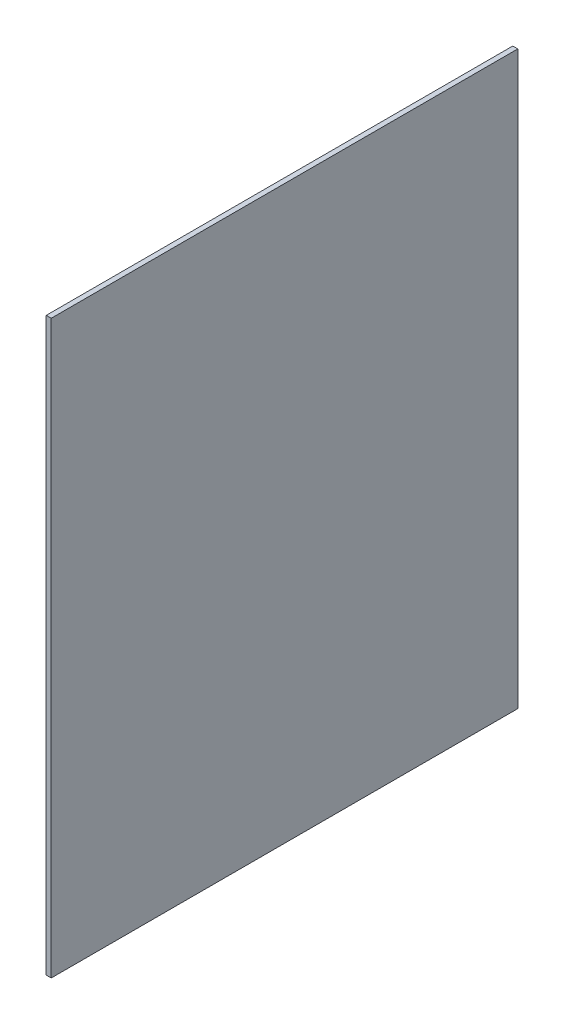
ISO-10303-21;
HEADER;
FILE_DESCRIPTION(('STEP AP214'),'2;1');
FILE_NAME('part.step','',(''),(''),'','','');
FILE_SCHEMA(('AUTOMOTIVE_DESIGN { 1 0 10303 214 1 1 1 1 }'));
ENDSEC;
DATA;
#1=APPLICATION_CONTEXT('core data for automotive mechanical design processes');
#2=APPLICATION_PROTOCOL_DEFINITION('international standard','automotive_design',2000,#1);
#3=PRODUCT_CONTEXT('',#1,'mechanical');
#4=PRODUCT('Part','Part','',(#3));
#5=PRODUCT_RELATED_PRODUCT_CATEGORY('part','',(#4));
#6=PRODUCT_DEFINITION_FORMATION('','',#4);
#7=PRODUCT_DEFINITION_CONTEXT('part definition',#1,'design');
#8=PRODUCT_DEFINITION('design','',#6,#7);
#9=PRODUCT_DEFINITION_SHAPE('','',#8);
#10=(LENGTH_UNIT() NAMED_UNIT(*) SI_UNIT(.MILLI.,.METRE.));
#11=(NAMED_UNIT(*) PLANE_ANGLE_UNIT() SI_UNIT($,.RADIAN.));
#12=(NAMED_UNIT(*) SI_UNIT($,.STERADIAN.) SOLID_ANGLE_UNIT());
#13=UNCERTAINTY_MEASURE_WITH_UNIT(LENGTH_MEASURE(1.E-05),#10,'distance_accuracy_value','');
#14=(GEOMETRIC_REPRESENTATION_CONTEXT(3) GLOBAL_UNCERTAINTY_ASSIGNED_CONTEXT((#13)) GLOBAL_UNIT_ASSIGNED_CONTEXT((#10,
#11,#12)) REPRESENTATION_CONTEXT('',''));
#15=CARTESIAN_POINT('',(0.,0.,0.));
#16=DIRECTION('',(0.,0.,1.));
#17=DIRECTION('',(1.,0.,0.));
#18=AXIS2_PLACEMENT_3D('',#15,#16,#17);
#19=CARTESIAN_POINT('',(9.525,-49.6523500577239,36.9162453960773));
#20=DIRECTION('',(0.,1.,0.));
#21=DIRECTION('',(0.,0.,1.));
#22=AXIS2_PLACEMENT_3D('',#19,#20,#21);
#23=PLANE('',#22);
#24=DIRECTION('',(0.,0.,-1.));
#25=VECTOR('',#24,1.);
#26=CARTESIAN_POINT('',(0.,-49.6523500577239,36.9162453960773));
#27=LINE('',#26,#25);
#28=CARTESIAN_POINT('',(0.,-49.6523500577239,36.9162453960773));
#29=VERTEX_POINT('',#28);
#30=CARTESIAN_POINT('',(0.,-49.6523500577239,-849.693166368629));
#31=VERTEX_POINT('',#30);
#32=EDGE_CURVE('E106',#29,#31,#27,.T.);
#33=ORIENTED_EDGE('',*,*,#32,.T.);
#34=DIRECTION('',(-1.,0.,0.));
#35=VECTOR('',#34,1.);
#36=CARTESIAN_POINT('',(9.525,-49.6523500577239,-849.693166368629));
#37=LINE('',#36,#35);
#38=CARTESIAN_POINT('',(9.525,-49.6523500577239,-849.693166368629));
#39=VERTEX_POINT('',#38);
#40=EDGE_CURVE('E11',#39,#31,#37,.T.);
#41=ORIENTED_EDGE('',*,*,#40,.F.);
#42=DIRECTION('',(0.,0.,-1.));
#43=VECTOR('',#42,1.);
#44=CARTESIAN_POINT('',(9.525,-49.6523500577239,36.9162453960773));
#45=LINE('',#44,#43);
#46=CARTESIAN_POINT('',(9.525,-49.6523500577239,36.9162453960773));
#47=VERTEX_POINT('',#46);
#48=EDGE_CURVE('E79',#47,#39,#45,.T.);
#49=ORIENTED_EDGE('',*,*,#48,.F.);
#50=DIRECTION('',(-1.,0.,0.));
#51=VECTOR('',#50,1.);
#52=CARTESIAN_POINT('',(9.525,-49.6523500577239,36.9162453960773));
#53=LINE('',#52,#51);
#54=EDGE_CURVE('E102',#47,#29,#53,.T.);
#55=ORIENTED_EDGE('',*,*,#54,.T.);
#56=EDGE_LOOP('',(#33,#41,#49,#55));
#57=FACE_BOUND('',#56,.T.);
#58=ADVANCED_FACE('F39',(#57),#23,.F.);
#59=CARTESIAN_POINT('',(9.525,1036.19764994228,-849.693166368629));
#60=DIRECTION('',(0.,0.,-1.));
#61=DIRECTION('',(0.,1.,0.));
#62=AXIS2_PLACEMENT_3D('',#59,#60,#61);
#63=PLANE('',#62);
#64=DIRECTION('',(0.,-1.,0.));
#65=VECTOR('',#64,1.);
#66=CARTESIAN_POINT('',(0.,1036.19764994228,-849.693166368629));
#67=LINE('',#66,#65);
#68=CARTESIAN_POINT('',(0.,1036.19764994228,-849.693166368629));
#69=VERTEX_POINT('',#68);
#70=EDGE_CURVE('E88',#69,#31,#67,.T.);
#71=ORIENTED_EDGE('',*,*,#70,.F.);
#72=DIRECTION('',(-1.,0.,0.));
#73=VECTOR('',#72,1.);
#74=CARTESIAN_POINT('',(9.525,1036.19764994228,-849.693166368629));
#75=LINE('',#74,#73);
#76=CARTESIAN_POINT('',(9.525,1036.19764994228,-849.693166368629));
#77=VERTEX_POINT('',#76);
#78=EDGE_CURVE('E48',#77,#69,#75,.T.);
#79=ORIENTED_EDGE('',*,*,#78,.F.);
#80=DIRECTION('',(0.,-1.,0.));
#81=VECTOR('',#80,1.);
#82=CARTESIAN_POINT('',(9.525,1036.19764994228,-849.693166368629));
#83=LINE('',#82,#81);
#84=EDGE_CURVE('E86',#77,#39,#83,.T.);
#85=ORIENTED_EDGE('',*,*,#84,.T.);
#86=ORIENTED_EDGE('',*,*,#40,.T.);
#87=EDGE_LOOP('',(#71,#79,#85,#86));
#88=FACE_BOUND('',#87,.T.);
#89=ADVANCED_FACE('F85',(#88),#63,.T.);
#90=CARTESIAN_POINT('',(9.525,1036.19764994228,36.9162453960774));
#91=DIRECTION('',(0.,1.,0.));
#92=DIRECTION('',(0.,0.,1.));
#93=AXIS2_PLACEMENT_3D('',#90,#91,#92);
#94=PLANE('',#93);
#95=DIRECTION('',(0.,0.,-1.));
#96=VECTOR('',#95,1.);
#97=CARTESIAN_POINT('',(0.,1036.19764994228,36.9162453960774));
#98=LINE('',#97,#96);
#99=CARTESIAN_POINT('',(0.,1036.19764994228,36.9162453960774));
#100=VERTEX_POINT('',#99);
#101=EDGE_CURVE('E112',#100,#69,#98,.T.);
#102=ORIENTED_EDGE('',*,*,#101,.F.);
#103=DIRECTION('',(-1.,0.,0.));
#104=VECTOR('',#103,1.);
#105=CARTESIAN_POINT('',(9.525,1036.19764994228,36.9162453960774));
#106=LINE('',#105,#104);
#107=CARTESIAN_POINT('',(9.525,1036.19764994228,36.9162453960774));
#108=VERTEX_POINT('',#107);
#109=EDGE_CURVE('E71',#108,#100,#106,.T.);
#110=ORIENTED_EDGE('',*,*,#109,.F.);
#111=DIRECTION('',(0.,0.,-1.));
#112=VECTOR('',#111,1.);
#113=CARTESIAN_POINT('',(9.525,1036.19764994228,36.9162453960774));
#114=LINE('',#113,#112);
#115=EDGE_CURVE('E95',#108,#77,#114,.T.);
#116=ORIENTED_EDGE('',*,*,#115,.T.);
#117=ORIENTED_EDGE('',*,*,#78,.T.);
#118=EDGE_LOOP('',(#102,#110,#116,#117));
#119=FACE_BOUND('',#118,.T.);
#120=ADVANCED_FACE('F98',(#119),#94,.T.);
#121=CARTESIAN_POINT('',(9.525,1036.19764994228,36.9162453960774));
#122=DIRECTION('',(0.,0.,-1.));
#123=DIRECTION('',(0.,1.,0.));
#124=AXIS2_PLACEMENT_3D('',#121,#122,#123);
#125=PLANE('',#124);
#126=DIRECTION('',(0.,-1.,0.));
#127=VECTOR('',#126,1.);
#128=CARTESIAN_POINT('',(0.,1036.19764994228,36.9162453960774));
#129=LINE('',#128,#127);
#130=EDGE_CURVE('E74',#100,#29,#129,.T.);
#131=ORIENTED_EDGE('',*,*,#130,.T.);
#132=ORIENTED_EDGE('',*,*,#54,.F.);
#133=DIRECTION('',(0.,-1.,0.));
#134=VECTOR('',#133,1.);
#135=CARTESIAN_POINT('',(9.525,1036.19764994228,36.9162453960774));
#136=LINE('',#135,#134);
#137=EDGE_CURVE('E56',#108,#47,#136,.T.);
#138=ORIENTED_EDGE('',*,*,#137,.F.);
#139=ORIENTED_EDGE('',*,*,#109,.T.);
#140=EDGE_LOOP('',(#131,#132,#138,#139));
#141=FACE_BOUND('',#140,.T.);
#142=ADVANCED_FACE('F129',(#141),#125,.F.);
#143=CARTESIAN_POINT('',(9.525,0.,0.));
#144=DIRECTION('',(-1.,0.,0.));
#145=DIRECTION('',(0.,0.,1.));
#146=AXIS2_PLACEMENT_3D('',#143,#144,#145);
#147=PLANE('',#146);
#148=ORIENTED_EDGE('',*,*,#48,.T.);
#149=ORIENTED_EDGE('',*,*,#84,.F.);
#150=ORIENTED_EDGE('',*,*,#115,.F.);
#151=ORIENTED_EDGE('',*,*,#137,.T.);
#152=EDGE_LOOP('',(#148,#149,#150,#151));
#153=FACE_BOUND('',#152,.T.);
#154=ADVANCED_FACE('F94',(#153),#147,.F.);
#155=CARTESIAN_POINT('',(0.,0.,0.));
#156=DIRECTION('',(-1.,0.,0.));
#157=DIRECTION('',(0.,0.,1.));
#158=AXIS2_PLACEMENT_3D('',#155,#156,#157);
#159=PLANE('',#158);
#160=ORIENTED_EDGE('',*,*,#32,.F.);
#161=ORIENTED_EDGE('',*,*,#130,.F.);
#162=ORIENTED_EDGE('',*,*,#101,.T.);
#163=ORIENTED_EDGE('',*,*,#70,.T.);
#164=EDGE_LOOP('',(#160,#161,#162,#163));
#165=FACE_BOUND('',#164,.T.);
#166=ADVANCED_FACE('F123',(#165),#159,.T.);
#167=CLOSED_SHELL('',(#58,#89,#120,#142,#154,#166));
#168=MANIFOLD_SOLID_BREP('B2',#167);
#169=ADVANCED_BREP_SHAPE_REPRESENTATION('',(#18,#168),#14);
#170=SHAPE_DEFINITION_REPRESENTATION(#9,#169);
ENDSEC;
END-ISO-10303-21;
